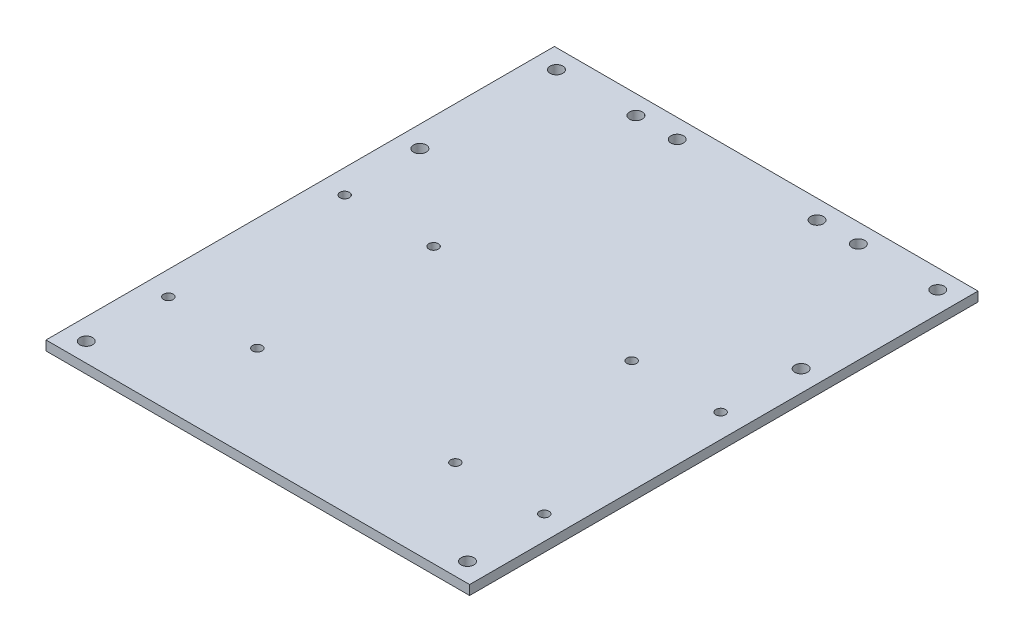
ISO-10303-21;
HEADER;
FILE_DESCRIPTION(('STEP AP214'),'2;1');
FILE_NAME('part.step','',(''),(''),'','','');
FILE_SCHEMA(('AUTOMOTIVE_DESIGN { 1 0 10303 214 1 1 1 1 }'));
ENDSEC;
DATA;
#1=APPLICATION_CONTEXT('core data for automotive mechanical design processes');
#2=APPLICATION_PROTOCOL_DEFINITION('international standard','automotive_design',2000,#1);
#3=PRODUCT_CONTEXT('',#1,'mechanical');
#4=PRODUCT('Part','Part','',(#3));
#5=PRODUCT_RELATED_PRODUCT_CATEGORY('part','',(#4));
#6=PRODUCT_DEFINITION_FORMATION('','',#4);
#7=PRODUCT_DEFINITION_CONTEXT('part definition',#1,'design');
#8=PRODUCT_DEFINITION('design','',#6,#7);
#9=PRODUCT_DEFINITION_SHAPE('','',#8);
#10=(LENGTH_UNIT() NAMED_UNIT(*) SI_UNIT(.MILLI.,.METRE.));
#11=(NAMED_UNIT(*) PLANE_ANGLE_UNIT() SI_UNIT($,.RADIAN.));
#12=(NAMED_UNIT(*) SI_UNIT($,.STERADIAN.) SOLID_ANGLE_UNIT());
#13=UNCERTAINTY_MEASURE_WITH_UNIT(LENGTH_MEASURE(1.E-05),#10,'distance_accuracy_value','');
#14=(GEOMETRIC_REPRESENTATION_CONTEXT(3) GLOBAL_UNCERTAINTY_ASSIGNED_CONTEXT((#13)) GLOBAL_UNIT_ASSIGNED_CONTEXT((#10,
#11,#12)) REPRESENTATION_CONTEXT('',''));
#15=CARTESIAN_POINT('',(0.,0.,0.));
#16=DIRECTION('',(0.,0.,1.));
#17=DIRECTION('',(1.,0.,0.));
#18=AXIS2_PLACEMENT_3D('',#15,#16,#17);
#19=CARTESIAN_POINT('',(66.665,3.,-80.));
#20=DIRECTION('',(-1.,0.,0.));
#21=DIRECTION('',(0.,0.,1.));
#22=AXIS2_PLACEMENT_3D('',#19,#20,#21);
#23=PLANE('',#22);
#24=DIRECTION('',(0.,0.,-1.));
#25=VECTOR('',#24,1.);
#26=CARTESIAN_POINT('',(66.665,0.,-80.));
#27=LINE('',#26,#25);
#28=CARTESIAN_POINT('',(66.665,0.,80.));
#29=VERTEX_POINT('',#28);
#30=CARTESIAN_POINT('',(66.665,0.,-80.));
#31=VERTEX_POINT('',#30);
#32=EDGE_CURVE('E106',#29,#31,#27,.T.);
#33=ORIENTED_EDGE('',*,*,#32,.T.);
#34=DIRECTION('',(0.,-1.,0.));
#35=VECTOR('',#34,1.);
#36=CARTESIAN_POINT('',(66.665,3.,-80.));
#37=LINE('',#36,#35);
#38=CARTESIAN_POINT('',(66.665,3.,-80.));
#39=VERTEX_POINT('',#38);
#40=EDGE_CURVE('E11',#39,#31,#37,.T.);
#41=ORIENTED_EDGE('',*,*,#40,.F.);
#42=DIRECTION('',(0.,0.,-1.));
#43=VECTOR('',#42,1.);
#44=CARTESIAN_POINT('',(66.665,3.,-80.));
#45=LINE('',#44,#43);
#46=CARTESIAN_POINT('',(66.665,3.,80.));
#47=VERTEX_POINT('',#46);
#48=EDGE_CURVE('E93',#47,#39,#45,.T.);
#49=ORIENTED_EDGE('',*,*,#48,.F.);
#50=DIRECTION('',(0.,-1.,0.));
#51=VECTOR('',#50,1.);
#52=CARTESIAN_POINT('',(66.665,3.,80.));
#53=LINE('',#52,#51);
#54=EDGE_CURVE('E102',#47,#29,#53,.T.);
#55=ORIENTED_EDGE('',*,*,#54,.T.);
#56=EDGE_LOOP('',(#33,#41,#49,#55));
#57=FACE_BOUND('',#56,.T.);
#58=ADVANCED_FACE('F40',(#57),#23,.F.);
#59=CARTESIAN_POINT('',(-66.665,3.,-80.));
#60=DIRECTION('',(0.,0.,1.));
#61=DIRECTION('',(1.,0.,0.));
#62=AXIS2_PLACEMENT_3D('',#59,#60,#61);
#63=PLANE('',#62);
#64=DIRECTION('',(-1.,0.,0.));
#65=VECTOR('',#64,1.);
#66=CARTESIAN_POINT('',(-66.665,0.,-80.));
#67=LINE('',#66,#65);
#68=CARTESIAN_POINT('',(-66.665,0.,-80.));
#69=VERTEX_POINT('',#68);
#70=EDGE_CURVE('E97',#31,#69,#67,.T.);
#71=ORIENTED_EDGE('',*,*,#70,.T.);
#72=DIRECTION('',(0.,-1.,0.));
#73=VECTOR('',#72,1.);
#74=CARTESIAN_POINT('',(-66.665,3.,-80.));
#75=LINE('',#74,#73);
#76=CARTESIAN_POINT('',(-66.665,3.,-80.));
#77=VERTEX_POINT('',#76);
#78=EDGE_CURVE('E49',#77,#69,#75,.T.);
#79=ORIENTED_EDGE('',*,*,#78,.F.);
#80=DIRECTION('',(-1.,0.,0.));
#81=VECTOR('',#80,1.);
#82=CARTESIAN_POINT('',(-66.665,3.,-80.));
#83=LINE('',#82,#81);
#84=EDGE_CURVE('E88',#39,#77,#83,.T.);
#85=ORIENTED_EDGE('',*,*,#84,.F.);
#86=ORIENTED_EDGE('',*,*,#40,.T.);
#87=EDGE_LOOP('',(#71,#79,#85,#86));
#88=FACE_BOUND('',#87,.T.);
#89=ADVANCED_FACE('F96',(#88),#63,.F.);
#90=CARTESIAN_POINT('',(-66.665,3.,-80.));
#91=DIRECTION('',(1.,0.,0.));
#92=DIRECTION('',(0.,0.,-1.));
#93=AXIS2_PLACEMENT_3D('',#90,#91,#92);
#94=PLANE('',#93);
#95=DIRECTION('',(0.,0.,1.));
#96=VECTOR('',#95,1.);
#97=CARTESIAN_POINT('',(-66.665,0.,-80.));
#98=LINE('',#97,#96);
#99=CARTESIAN_POINT('',(-66.665,0.,80.));
#100=VERTEX_POINT('',#99);
#101=EDGE_CURVE('E75',#69,#100,#98,.T.);
#102=ORIENTED_EDGE('',*,*,#101,.T.);
#103=DIRECTION('',(0.,-1.,0.));
#104=VECTOR('',#103,1.);
#105=CARTESIAN_POINT('',(-66.665,3.,80.));
#106=LINE('',#105,#104);
#107=CARTESIAN_POINT('',(-66.665,3.,80.));
#108=VERTEX_POINT('',#107);
#109=EDGE_CURVE('E98',#108,#100,#106,.T.);
#110=ORIENTED_EDGE('',*,*,#109,.F.);
#111=DIRECTION('',(0.,0.,1.));
#112=VECTOR('',#111,1.);
#113=CARTESIAN_POINT('',(-66.665,3.,-80.));
#114=LINE('',#113,#112);
#115=EDGE_CURVE('E91',#77,#108,#114,.T.);
#116=ORIENTED_EDGE('',*,*,#115,.F.);
#117=ORIENTED_EDGE('',*,*,#78,.T.);
#118=EDGE_LOOP('',(#102,#110,#116,#117));
#119=FACE_BOUND('',#118,.T.);
#120=ADVANCED_FACE('F100',(#119),#94,.F.);
#121=CARTESIAN_POINT('',(-66.665,3.,80.));
#122=DIRECTION('',(0.,0.,-1.));
#123=DIRECTION('',(-1.,0.,0.));
#124=AXIS2_PLACEMENT_3D('',#121,#122,#123);
#125=PLANE('',#124);
#126=DIRECTION('',(1.,0.,0.));
#127=VECTOR('',#126,1.);
#128=CARTESIAN_POINT('',(-66.665,0.,80.));
#129=LINE('',#128,#127);
#130=EDGE_CURVE('E81',#100,#29,#129,.T.);
#131=ORIENTED_EDGE('',*,*,#130,.T.);
#132=ORIENTED_EDGE('',*,*,#54,.F.);
#133=DIRECTION('',(1.,0.,0.));
#134=VECTOR('',#133,1.);
#135=CARTESIAN_POINT('',(-66.665,3.,80.));
#136=LINE('',#135,#134);
#137=EDGE_CURVE('E58',#108,#47,#136,.T.);
#138=ORIENTED_EDGE('',*,*,#137,.F.);
#139=ORIENTED_EDGE('',*,*,#109,.T.);
#140=EDGE_LOOP('',(#131,#132,#138,#139));
#141=FACE_BOUND('',#140,.T.);
#142=ADVANCED_FACE('F220',(#141),#125,.F.);
#143=CARTESIAN_POINT('',(0.,3.,0.));
#144=DIRECTION('',(0.,1.,0.));
#145=DIRECTION('',(0.,0.,1.));
#146=AXIS2_PLACEMENT_3D('',#143,#144,#145);
#147=PLANE('',#146);
#148=CARTESIAN_POINT('',(-22.,3.,-74.));
#149=DIRECTION('',(0.,1.,0.));
#150=DIRECTION('',(0.,0.,1.));
#151=AXIS2_PLACEMENT_3D('',#148,#149,#150);
#152=CIRCLE('',#151,2.00000000000001);
#153=CARTESIAN_POINT('',(-22.,3.,-72.));
#154=VERTEX_POINT('',#153);
#155=EDGE_CURVE('E503',#154,#154,#152,.T.);
#156=ORIENTED_EDGE('',*,*,#155,.F.);
#157=EDGE_LOOP('',(#156));
#158=FACE_BOUND('',#157,.T.);
#159=CARTESIAN_POINT('',(22.,3.,-74.));
#160=DIRECTION('',(0.,1.,0.));
#161=DIRECTION('',(0.,0.,-1.));
#162=AXIS2_PLACEMENT_3D('',#159,#160,#161);
#163=CIRCLE('',#162,2.00000000000001);
#164=CARTESIAN_POINT('',(22.,3.,-76.));
#165=VERTEX_POINT('',#164);
#166=EDGE_CURVE('E504',#165,#165,#163,.T.);
#167=ORIENTED_EDGE('',*,*,#166,.F.);
#168=EDGE_LOOP('',(#167));
#169=FACE_BOUND('',#168,.T.);
#170=CARTESIAN_POINT('',(-35.,3.,-74.));
#171=DIRECTION('',(0.,1.,0.));
#172=DIRECTION('',(0.,0.,1.));
#173=AXIS2_PLACEMENT_3D('',#170,#171,#172);
#174=CIRCLE('',#173,2.);
#175=CARTESIAN_POINT('',(-35.,3.,-72.));
#176=VERTEX_POINT('',#175);
#177=EDGE_CURVE('E116',#176,#176,#174,.T.);
#178=ORIENTED_EDGE('',*,*,#177,.F.);
#179=EDGE_LOOP('',(#178));
#180=FACE_BOUND('',#179,.T.);
#181=CARTESIAN_POINT('',(35.,3.,-74.));
#182=DIRECTION('',(0.,1.,0.));
#183=DIRECTION('',(0.,0.,1.));
#184=AXIS2_PLACEMENT_3D('',#181,#182,#183);
#185=CIRCLE('',#184,2.);
#186=CARTESIAN_POINT('',(35.,3.,-72.));
#187=VERTEX_POINT('',#186);
#188=EDGE_CURVE('E122',#187,#187,#185,.T.);
#189=ORIENTED_EDGE('',*,*,#188,.F.);
#190=EDGE_LOOP('',(#189));
#191=FACE_BOUND('',#190,.T.);
#192=CARTESIAN_POINT('',(59.165,3.,-6.50000000000002));
#193=DIRECTION('',(0.,1.,0.));
#194=DIRECTION('',(0.,0.,-1.));
#195=AXIS2_PLACEMENT_3D('',#192,#193,#194);
#196=CIRCLE('',#195,1.5);
#197=CARTESIAN_POINT('',(59.165,3.,-8.00000000000002));
#198=VERTEX_POINT('',#197);
#199=EDGE_CURVE('E158',#198,#198,#196,.T.);
#200=ORIENTED_EDGE('',*,*,#199,.F.);
#201=EDGE_LOOP('',(#200));
#202=FACE_BOUND('',#201,.T.);
#203=CARTESIAN_POINT('',(59.165,3.,49.));
#204=DIRECTION('',(0.,1.,0.));
#205=DIRECTION('',(0.,0.,-1.));
#206=AXIS2_PLACEMENT_3D('',#203,#204,#205);
#207=CIRCLE('',#206,1.5);
#208=CARTESIAN_POINT('',(59.165,3.,47.5));
#209=VERTEX_POINT('',#208);
#210=EDGE_CURVE('E152',#209,#209,#207,.T.);
#211=ORIENTED_EDGE('',*,*,#210,.F.);
#212=EDGE_LOOP('',(#211));
#213=FACE_BOUND('',#212,.T.);
#214=CARTESIAN_POINT('',(31.165,3.,49.));
#215=DIRECTION('',(0.,1.,0.));
#216=DIRECTION('',(0.,0.,-1.));
#217=AXIS2_PLACEMENT_3D('',#214,#215,#216);
#218=CIRCLE('',#217,1.5);
#219=CARTESIAN_POINT('',(31.165,3.,47.5));
#220=VERTEX_POINT('',#219);
#221=EDGE_CURVE('E146',#220,#220,#218,.T.);
#222=ORIENTED_EDGE('',*,*,#221,.F.);
#223=EDGE_LOOP('',(#222));
#224=FACE_BOUND('',#223,.T.);
#225=CARTESIAN_POINT('',(-31.165,3.,49.));
#226=DIRECTION('',(0.,1.,0.));
#227=DIRECTION('',(0.,0.,1.));
#228=AXIS2_PLACEMENT_3D('',#225,#226,#227);
#229=CIRCLE('',#228,1.5);
#230=CARTESIAN_POINT('',(-31.165,3.,50.5));
#231=VERTEX_POINT('',#230);
#232=EDGE_CURVE('E139',#231,#231,#229,.T.);
#233=ORIENTED_EDGE('',*,*,#232,.F.);
#234=EDGE_LOOP('',(#233));
#235=FACE_BOUND('',#234,.T.);
#236=CARTESIAN_POINT('',(60.,3.,-31.));
#237=DIRECTION('',(0.,1.,0.));
#238=DIRECTION('',(0.,0.,-1.));
#239=AXIS2_PLACEMENT_3D('',#236,#237,#238);
#240=CIRCLE('',#239,2.);
#241=CARTESIAN_POINT('',(60.,3.,-33.));
#242=VERTEX_POINT('',#241);
#243=EDGE_CURVE('E175',#242,#242,#240,.T.);
#244=ORIENTED_EDGE('',*,*,#243,.F.);
#245=EDGE_LOOP('',(#244));
#246=FACE_BOUND('',#245,.T.);
#247=CARTESIAN_POINT('',(-59.165,3.,-6.50000000000002));
#248=DIRECTION('',(0.,1.,0.));
#249=DIRECTION('',(0.,0.,1.));
#250=AXIS2_PLACEMENT_3D('',#247,#248,#249);
#251=CIRCLE('',#250,1.5);
#252=CARTESIAN_POINT('',(-59.165,3.,-5.00000000000002));
#253=VERTEX_POINT('',#252);
#254=EDGE_CURVE('E182',#253,#253,#251,.T.);
#255=ORIENTED_EDGE('',*,*,#254,.F.);
#256=EDGE_LOOP('',(#255));
#257=FACE_BOUND('',#256,.T.);
#258=CARTESIAN_POINT('',(-31.165,3.,-6.50000000000002));
#259=DIRECTION('',(0.,1.,0.));
#260=DIRECTION('',(0.,0.,1.));
#261=AXIS2_PLACEMENT_3D('',#258,#259,#260);
#262=CIRCLE('',#261,1.5);
#263=CARTESIAN_POINT('',(-31.165,3.,-5.00000000000002));
#264=VERTEX_POINT('',#263);
#265=EDGE_CURVE('E163',#264,#264,#262,.T.);
#266=ORIENTED_EDGE('',*,*,#265,.F.);
#267=EDGE_LOOP('',(#266));
#268=FACE_BOUND('',#267,.T.);
#269=CARTESIAN_POINT('',(-59.165,3.,49.));
#270=DIRECTION('',(0.,1.,0.));
#271=DIRECTION('',(0.,0.,1.));
#272=AXIS2_PLACEMENT_3D('',#269,#270,#271);
#273=CIRCLE('',#272,1.5);
#274=CARTESIAN_POINT('',(-59.165,3.,50.5));
#275=VERTEX_POINT('',#274);
#276=EDGE_CURVE('E170',#275,#275,#273,.T.);
#277=ORIENTED_EDGE('',*,*,#276,.F.);
#278=EDGE_LOOP('',(#277));
#279=FACE_BOUND('',#278,.T.);
#280=CARTESIAN_POINT('',(31.165,3.,-6.50000000000002));
#281=DIRECTION('',(0.,1.,0.));
#282=DIRECTION('',(0.,0.,-1.));
#283=AXIS2_PLACEMENT_3D('',#280,#281,#282);
#284=CIRCLE('',#283,1.5);
#285=CARTESIAN_POINT('',(31.165,3.,-8.00000000000002));
#286=VERTEX_POINT('',#285);
#287=EDGE_CURVE('E133',#286,#286,#284,.T.);
#288=ORIENTED_EDGE('',*,*,#287,.F.);
#289=EDGE_LOOP('',(#288));
#290=FACE_BOUND('',#289,.T.);
#291=CARTESIAN_POINT('',(-60.,3.,-31.));
#292=DIRECTION('',(0.,1.,0.));
#293=DIRECTION('',(0.,0.,1.));
#294=AXIS2_PLACEMENT_3D('',#291,#292,#293);
#295=CIRCLE('',#294,2.);
#296=CARTESIAN_POINT('',(-60.,3.,-29.));
#297=VERTEX_POINT('',#296);
#298=EDGE_CURVE('E178',#297,#297,#295,.T.);
#299=ORIENTED_EDGE('',*,*,#298,.F.);
#300=EDGE_LOOP('',(#299));
#301=FACE_BOUND('',#300,.T.);
#302=CARTESIAN_POINT('',(-60.,3.,74.));
#303=DIRECTION('',(0.,1.,0.));
#304=DIRECTION('',(0.,0.,-1.));
#305=AXIS2_PLACEMENT_3D('',#302,#303,#304);
#306=CIRCLE('',#305,2.);
#307=CARTESIAN_POINT('',(-60.,3.,72.));
#308=VERTEX_POINT('',#307);
#309=EDGE_CURVE('E206',#308,#308,#306,.T.);
#310=ORIENTED_EDGE('',*,*,#309,.F.);
#311=EDGE_LOOP('',(#310));
#312=FACE_BOUND('',#311,.T.);
#313=CARTESIAN_POINT('',(60.,3.,74.));
#314=DIRECTION('',(0.,1.,0.));
#315=DIRECTION('',(0.,0.,1.));
#316=AXIS2_PLACEMENT_3D('',#313,#314,#315);
#317=CIRCLE('',#316,2.);
#318=CARTESIAN_POINT('',(60.,3.,76.));
#319=VERTEX_POINT('',#318);
#320=EDGE_CURVE('E200',#319,#319,#317,.T.);
#321=ORIENTED_EDGE('',*,*,#320,.F.);
#322=EDGE_LOOP('',(#321));
#323=FACE_BOUND('',#322,.T.);
#324=CARTESIAN_POINT('',(60.,3.,-74.));
#325=DIRECTION('',(0.,1.,0.));
#326=DIRECTION('',(0.,0.,-1.));
#327=AXIS2_PLACEMENT_3D('',#324,#325,#326);
#328=CIRCLE('',#327,2.);
#329=CARTESIAN_POINT('',(60.,3.,-76.));
#330=VERTEX_POINT('',#329);
#331=EDGE_CURVE('E193',#330,#330,#328,.T.);
#332=ORIENTED_EDGE('',*,*,#331,.F.);
#333=EDGE_LOOP('',(#332));
#334=FACE_BOUND('',#333,.T.);
#335=CARTESIAN_POINT('',(-60.,3.,-74.));
#336=DIRECTION('',(0.,1.,0.));
#337=DIRECTION('',(0.,0.,1.));
#338=AXIS2_PLACEMENT_3D('',#335,#336,#337);
#339=CIRCLE('',#338,2.);
#340=CARTESIAN_POINT('',(-60.,3.,-72.));
#341=VERTEX_POINT('',#340);
#342=EDGE_CURVE('E196',#341,#341,#339,.T.);
#343=ORIENTED_EDGE('',*,*,#342,.F.);
#344=EDGE_LOOP('',(#343));
#345=FACE_BOUND('',#344,.T.);
#346=ORIENTED_EDGE('',*,*,#48,.T.);
#347=ORIENTED_EDGE('',*,*,#84,.T.);
#348=ORIENTED_EDGE('',*,*,#115,.T.);
#349=ORIENTED_EDGE('',*,*,#137,.T.);
#350=EDGE_LOOP('',(#346,#347,#348,#349));
#351=FACE_BOUND('',#350,.T.);
#352=ADVANCED_FACE('F89',(#158,#169,#180,#191,#202,#213,#224,#235,#246,#257,#268,#279,#290,#301,
#312,#323,#334,#345,#351),#147,.T.);
#353=CARTESIAN_POINT('',(0.,0.,0.));
#354=DIRECTION('',(0.,1.,0.));
#355=DIRECTION('',(0.,0.,1.));
#356=AXIS2_PLACEMENT_3D('',#353,#354,#355);
#357=PLANE('',#356);
#358=CARTESIAN_POINT('',(-22.,0.,-74.));
#359=DIRECTION('',(0.,1.,0.));
#360=DIRECTION('',(0.,0.,1.));
#361=AXIS2_PLACEMENT_3D('',#358,#359,#360);
#362=CIRCLE('',#361,2.00000000000001);
#363=CARTESIAN_POINT('',(-22.,0.,-72.));
#364=VERTEX_POINT('',#363);
#365=EDGE_CURVE('E127',#364,#364,#362,.T.);
#366=ORIENTED_EDGE('',*,*,#365,.T.);
#367=EDGE_LOOP('',(#366));
#368=FACE_BOUND('',#367,.T.);
#369=CARTESIAN_POINT('',(22.,0.,-74.));
#370=DIRECTION('',(0.,1.,0.));
#371=DIRECTION('',(0.,0.,-1.));
#372=AXIS2_PLACEMENT_3D('',#369,#370,#371);
#373=CIRCLE('',#372,2.00000000000001);
#374=CARTESIAN_POINT('',(22.,0.,-76.));
#375=VERTEX_POINT('',#374);
#376=EDGE_CURVE('E130',#375,#375,#373,.T.);
#377=ORIENTED_EDGE('',*,*,#376,.T.);
#378=EDGE_LOOP('',(#377));
#379=FACE_BOUND('',#378,.T.);
#380=CARTESIAN_POINT('',(-35.,0.,-74.));
#381=DIRECTION('',(0.,1.,0.));
#382=DIRECTION('',(0.,0.,1.));
#383=AXIS2_PLACEMENT_3D('',#380,#381,#382);
#384=CIRCLE('',#383,2.);
#385=CARTESIAN_POINT('',(-35.,0.,-72.));
#386=VERTEX_POINT('',#385);
#387=EDGE_CURVE('E43',#386,#386,#384,.T.);
#388=ORIENTED_EDGE('',*,*,#387,.T.);
#389=EDGE_LOOP('',(#388));
#390=FACE_BOUND('',#389,.T.);
#391=CARTESIAN_POINT('',(35.,0.,-74.));
#392=DIRECTION('',(0.,1.,0.));
#393=DIRECTION('',(0.,0.,1.));
#394=AXIS2_PLACEMENT_3D('',#391,#392,#393);
#395=CIRCLE('',#394,2.);
#396=CARTESIAN_POINT('',(35.,0.,-72.));
#397=VERTEX_POINT('',#396);
#398=EDGE_CURVE('E114',#397,#397,#395,.T.);
#399=ORIENTED_EDGE('',*,*,#398,.T.);
#400=EDGE_LOOP('',(#399));
#401=FACE_BOUND('',#400,.T.);
#402=CARTESIAN_POINT('',(59.165,0.,-6.50000000000002));
#403=DIRECTION('',(0.,1.,0.));
#404=DIRECTION('',(0.,0.,-1.));
#405=AXIS2_PLACEMENT_3D('',#402,#403,#404);
#406=CIRCLE('',#405,1.5);
#407=CARTESIAN_POINT('',(59.165,0.,-8.00000000000002));
#408=VERTEX_POINT('',#407);
#409=EDGE_CURVE('E136',#408,#408,#406,.T.);
#410=ORIENTED_EDGE('',*,*,#409,.T.);
#411=EDGE_LOOP('',(#410));
#412=FACE_BOUND('',#411,.T.);
#413=CARTESIAN_POINT('',(59.165,0.,49.));
#414=DIRECTION('',(0.,1.,0.));
#415=DIRECTION('',(0.,0.,-1.));
#416=AXIS2_PLACEMENT_3D('',#413,#414,#415);
#417=CIRCLE('',#416,1.5);
#418=CARTESIAN_POINT('',(59.165,0.,47.5));
#419=VERTEX_POINT('',#418);
#420=EDGE_CURVE('E155',#419,#419,#417,.T.);
#421=ORIENTED_EDGE('',*,*,#420,.T.);
#422=EDGE_LOOP('',(#421));
#423=FACE_BOUND('',#422,.T.);
#424=CARTESIAN_POINT('',(31.165,0.,49.));
#425=DIRECTION('',(0.,1.,0.));
#426=DIRECTION('',(0.,0.,-1.));
#427=AXIS2_PLACEMENT_3D('',#424,#425,#426);
#428=CIRCLE('',#427,1.5);
#429=CARTESIAN_POINT('',(31.165,0.,47.5));
#430=VERTEX_POINT('',#429);
#431=EDGE_CURVE('E149',#430,#430,#428,.T.);
#432=ORIENTED_EDGE('',*,*,#431,.T.);
#433=EDGE_LOOP('',(#432));
#434=FACE_BOUND('',#433,.T.);
#435=CARTESIAN_POINT('',(-31.165,0.,49.));
#436=DIRECTION('',(0.,1.,0.));
#437=DIRECTION('',(0.,0.,1.));
#438=AXIS2_PLACEMENT_3D('',#435,#436,#437);
#439=CIRCLE('',#438,1.5);
#440=CARTESIAN_POINT('',(-31.165,0.,50.5));
#441=VERTEX_POINT('',#440);
#442=EDGE_CURVE('E143',#441,#441,#439,.T.);
#443=ORIENTED_EDGE('',*,*,#442,.T.);
#444=EDGE_LOOP('',(#443));
#445=FACE_BOUND('',#444,.T.);
#446=CARTESIAN_POINT('',(60.,0.,-31.));
#447=DIRECTION('',(0.,1.,0.));
#448=DIRECTION('',(0.,0.,-1.));
#449=AXIS2_PLACEMENT_3D('',#446,#447,#448);
#450=CIRCLE('',#449,2.);
#451=CARTESIAN_POINT('',(60.,0.,-33.));
#452=VERTEX_POINT('',#451);
#453=EDGE_CURVE('E179',#452,#452,#450,.T.);
#454=ORIENTED_EDGE('',*,*,#453,.T.);
#455=EDGE_LOOP('',(#454));
#456=FACE_BOUND('',#455,.T.);
#457=CARTESIAN_POINT('',(-59.165,0.,-6.50000000000002));
#458=DIRECTION('',(0.,1.,0.));
#459=DIRECTION('',(0.,0.,1.));
#460=AXIS2_PLACEMENT_3D('',#457,#458,#459);
#461=CIRCLE('',#460,1.5);
#462=CARTESIAN_POINT('',(-59.165,0.,-5.00000000000002));
#463=VERTEX_POINT('',#462);
#464=EDGE_CURVE('E166',#463,#463,#461,.T.);
#465=ORIENTED_EDGE('',*,*,#464,.T.);
#466=EDGE_LOOP('',(#465));
#467=FACE_BOUND('',#466,.T.);
#468=CARTESIAN_POINT('',(-31.165,0.,-6.50000000000002));
#469=DIRECTION('',(0.,1.,0.));
#470=DIRECTION('',(0.,0.,1.));
#471=AXIS2_PLACEMENT_3D('',#468,#469,#470);
#472=CIRCLE('',#471,1.5);
#473=CARTESIAN_POINT('',(-31.165,0.,-5.00000000000002));
#474=VERTEX_POINT('',#473);
#475=EDGE_CURVE('E167',#474,#474,#472,.T.);
#476=ORIENTED_EDGE('',*,*,#475,.T.);
#477=EDGE_LOOP('',(#476));
#478=FACE_BOUND('',#477,.T.);
#479=CARTESIAN_POINT('',(-59.165,0.,49.));
#480=DIRECTION('',(0.,1.,0.));
#481=DIRECTION('',(0.,0.,1.));
#482=AXIS2_PLACEMENT_3D('',#479,#480,#481);
#483=CIRCLE('',#482,1.5);
#484=CARTESIAN_POINT('',(-59.165,0.,50.5));
#485=VERTEX_POINT('',#484);
#486=EDGE_CURVE('E142',#485,#485,#483,.T.);
#487=ORIENTED_EDGE('',*,*,#486,.T.);
#488=EDGE_LOOP('',(#487));
#489=FACE_BOUND('',#488,.T.);
#490=CARTESIAN_POINT('',(31.165,0.,-6.50000000000002));
#491=DIRECTION('',(0.,1.,0.));
#492=DIRECTION('',(0.,0.,-1.));
#493=AXIS2_PLACEMENT_3D('',#490,#491,#492);
#494=CIRCLE('',#493,1.5);
#495=CARTESIAN_POINT('',(31.165,0.,-8.00000000000002));
#496=VERTEX_POINT('',#495);
#497=EDGE_CURVE('E120',#496,#496,#494,.T.);
#498=ORIENTED_EDGE('',*,*,#497,.T.);
#499=EDGE_LOOP('',(#498));
#500=FACE_BOUND('',#499,.T.);
#501=CARTESIAN_POINT('',(-60.,0.,-31.));
#502=DIRECTION('',(0.,1.,0.));
#503=DIRECTION('',(0.,0.,1.));
#504=AXIS2_PLACEMENT_3D('',#501,#502,#503);
#505=CIRCLE('',#504,2.);
#506=CARTESIAN_POINT('',(-60.,0.,-29.));
#507=VERTEX_POINT('',#506);
#508=EDGE_CURVE('E187',#507,#507,#505,.T.);
#509=ORIENTED_EDGE('',*,*,#508,.T.);
#510=EDGE_LOOP('',(#509));
#511=FACE_BOUND('',#510,.T.);
#512=CARTESIAN_POINT('',(-60.,0.,74.));
#513=DIRECTION('',(0.,1.,0.));
#514=DIRECTION('',(0.,0.,-1.));
#515=AXIS2_PLACEMENT_3D('',#512,#513,#514);
#516=CIRCLE('',#515,2.);
#517=CARTESIAN_POINT('',(-60.,0.,72.));
#518=VERTEX_POINT('',#517);
#519=EDGE_CURVE('E190',#518,#518,#516,.T.);
#520=ORIENTED_EDGE('',*,*,#519,.T.);
#521=EDGE_LOOP('',(#520));
#522=FACE_BOUND('',#521,.T.);
#523=CARTESIAN_POINT('',(60.,0.,74.));
#524=DIRECTION('',(0.,1.,0.));
#525=DIRECTION('',(0.,0.,1.));
#526=AXIS2_PLACEMENT_3D('',#523,#524,#525);
#527=CIRCLE('',#526,2.);
#528=CARTESIAN_POINT('',(60.,0.,76.));
#529=VERTEX_POINT('',#528);
#530=EDGE_CURVE('E203',#529,#529,#527,.T.);
#531=ORIENTED_EDGE('',*,*,#530,.T.);
#532=EDGE_LOOP('',(#531));
#533=FACE_BOUND('',#532,.T.);
#534=CARTESIAN_POINT('',(60.,0.,-74.));
#535=DIRECTION('',(0.,1.,0.));
#536=DIRECTION('',(0.,0.,-1.));
#537=AXIS2_PLACEMENT_3D('',#534,#535,#536);
#538=CIRCLE('',#537,2.);
#539=CARTESIAN_POINT('',(60.,0.,-76.));
#540=VERTEX_POINT('',#539);
#541=EDGE_CURVE('E197',#540,#540,#538,.T.);
#542=ORIENTED_EDGE('',*,*,#541,.T.);
#543=EDGE_LOOP('',(#542));
#544=FACE_BOUND('',#543,.T.);
#545=CARTESIAN_POINT('',(-60.,0.,-74.));
#546=DIRECTION('',(0.,1.,0.));
#547=DIRECTION('',(0.,0.,1.));
#548=AXIS2_PLACEMENT_3D('',#545,#546,#547);
#549=CIRCLE('',#548,2.);
#550=CARTESIAN_POINT('',(-60.,0.,-72.));
#551=VERTEX_POINT('',#550);
#552=EDGE_CURVE('E109',#551,#551,#549,.T.);
#553=ORIENTED_EDGE('',*,*,#552,.T.);
#554=EDGE_LOOP('',(#553));
#555=FACE_BOUND('',#554,.T.);
#556=ORIENTED_EDGE('',*,*,#32,.F.);
#557=ORIENTED_EDGE('',*,*,#130,.F.);
#558=ORIENTED_EDGE('',*,*,#101,.F.);
#559=ORIENTED_EDGE('',*,*,#70,.F.);
#560=EDGE_LOOP('',(#556,#557,#558,#559));
#561=FACE_BOUND('',#560,.T.);
#562=ADVANCED_FACE('F219',(#368,#379,#390,#401,#412,#423,#434,#445,#456,#467,#478,#489,#500,
#511,#522,#533,#544,#555,#561),#357,.F.);
#563=CARTESIAN_POINT('',(-60.,0.,-74.));
#564=DIRECTION('',(0.,1.,0.));
#565=DIRECTION('',(0.,0.,1.));
#566=AXIS2_PLACEMENT_3D('',#563,#564,#565);
#567=CYLINDRICAL_SURFACE('',#566,2.);
#568=ORIENTED_EDGE('',*,*,#552,.F.);
#569=EDGE_LOOP('',(#568));
#570=FACE_BOUND('',#569,.T.);
#571=ORIENTED_EDGE('',*,*,#342,.T.);
#572=EDGE_LOOP('',(#571));
#573=FACE_BOUND('',#572,.T.);
#574=ADVANCED_FACE('F216',(#570,#573),#567,.F.);
#575=CARTESIAN_POINT('',(60.,0.,-74.));
#576=DIRECTION('',(0.,1.,0.));
#577=DIRECTION('',(0.,0.,1.));
#578=AXIS2_PLACEMENT_3D('',#575,#576,#577);
#579=CYLINDRICAL_SURFACE('',#578,2.);
#580=ORIENTED_EDGE('',*,*,#541,.F.);
#581=EDGE_LOOP('',(#580));
#582=FACE_BOUND('',#581,.T.);
#583=ORIENTED_EDGE('',*,*,#331,.T.);
#584=EDGE_LOOP('',(#583));
#585=FACE_BOUND('',#584,.T.);
#586=ADVANCED_FACE('F261',(#582,#585),#579,.F.);
#587=CARTESIAN_POINT('',(60.,0.,74.));
#588=DIRECTION('',(0.,1.,0.));
#589=DIRECTION('',(0.,0.,1.));
#590=AXIS2_PLACEMENT_3D('',#587,#588,#589);
#591=CYLINDRICAL_SURFACE('',#590,2.);
#592=ORIENTED_EDGE('',*,*,#530,.F.);
#593=EDGE_LOOP('',(#592));
#594=FACE_BOUND('',#593,.T.);
#595=ORIENTED_EDGE('',*,*,#320,.T.);
#596=EDGE_LOOP('',(#595));
#597=FACE_BOUND('',#596,.T.);
#598=ADVANCED_FACE('F272',(#594,#597),#591,.F.);
#599=CARTESIAN_POINT('',(-60.,0.,74.));
#600=DIRECTION('',(0.,1.,0.));
#601=DIRECTION('',(0.,0.,1.));
#602=AXIS2_PLACEMENT_3D('',#599,#600,#601);
#603=CYLINDRICAL_SURFACE('',#602,2.);
#604=ORIENTED_EDGE('',*,*,#519,.F.);
#605=EDGE_LOOP('',(#604));
#606=FACE_BOUND('',#605,.T.);
#607=ORIENTED_EDGE('',*,*,#309,.T.);
#608=EDGE_LOOP('',(#607));
#609=FACE_BOUND('',#608,.T.);
#610=ADVANCED_FACE('F283',(#606,#609),#603,.F.);
#611=CARTESIAN_POINT('',(-60.,0.,-31.));
#612=DIRECTION('',(0.,1.,0.));
#613=DIRECTION('',(0.,0.,1.));
#614=AXIS2_PLACEMENT_3D('',#611,#612,#613);
#615=CYLINDRICAL_SURFACE('',#614,2.);
#616=ORIENTED_EDGE('',*,*,#508,.F.);
#617=EDGE_LOOP('',(#616));
#618=FACE_BOUND('',#617,.T.);
#619=ORIENTED_EDGE('',*,*,#298,.T.);
#620=EDGE_LOOP('',(#619));
#621=FACE_BOUND('',#620,.T.);
#622=ADVANCED_FACE('F294',(#618,#621),#615,.F.);
#623=CARTESIAN_POINT('',(31.165,0.,-6.50000000000002));
#624=DIRECTION('',(0.,1.,0.));
#625=DIRECTION('',(0.,0.,1.));
#626=AXIS2_PLACEMENT_3D('',#623,#624,#625);
#627=CYLINDRICAL_SURFACE('',#626,1.5);
#628=ORIENTED_EDGE('',*,*,#497,.F.);
#629=EDGE_LOOP('',(#628));
#630=FACE_BOUND('',#629,.T.);
#631=ORIENTED_EDGE('',*,*,#287,.T.);
#632=EDGE_LOOP('',(#631));
#633=FACE_BOUND('',#632,.T.);
#634=ADVANCED_FACE('F305',(#630,#633),#627,.F.);
#635=CARTESIAN_POINT('',(-59.165,0.,49.));
#636=DIRECTION('',(0.,1.,0.));
#637=DIRECTION('',(0.,0.,1.));
#638=AXIS2_PLACEMENT_3D('',#635,#636,#637);
#639=CYLINDRICAL_SURFACE('',#638,1.5);
#640=ORIENTED_EDGE('',*,*,#486,.F.);
#641=EDGE_LOOP('',(#640));
#642=FACE_BOUND('',#641,.T.);
#643=ORIENTED_EDGE('',*,*,#276,.T.);
#644=EDGE_LOOP('',(#643));
#645=FACE_BOUND('',#644,.T.);
#646=ADVANCED_FACE('F316',(#642,#645),#639,.F.);
#647=CARTESIAN_POINT('',(-31.165,0.,-6.50000000000002));
#648=DIRECTION('',(0.,1.,0.));
#649=DIRECTION('',(0.,0.,1.));
#650=AXIS2_PLACEMENT_3D('',#647,#648,#649);
#651=CYLINDRICAL_SURFACE('',#650,1.5);
#652=ORIENTED_EDGE('',*,*,#475,.F.);
#653=EDGE_LOOP('',(#652));
#654=FACE_BOUND('',#653,.T.);
#655=ORIENTED_EDGE('',*,*,#265,.T.);
#656=EDGE_LOOP('',(#655));
#657=FACE_BOUND('',#656,.T.);
#658=ADVANCED_FACE('F327',(#654,#657),#651,.F.);
#659=CARTESIAN_POINT('',(-59.165,0.,-6.50000000000002));
#660=DIRECTION('',(0.,1.,0.));
#661=DIRECTION('',(0.,0.,1.));
#662=AXIS2_PLACEMENT_3D('',#659,#660,#661);
#663=CYLINDRICAL_SURFACE('',#662,1.5);
#664=ORIENTED_EDGE('',*,*,#464,.F.);
#665=EDGE_LOOP('',(#664));
#666=FACE_BOUND('',#665,.T.);
#667=ORIENTED_EDGE('',*,*,#254,.T.);
#668=EDGE_LOOP('',(#667));
#669=FACE_BOUND('',#668,.T.);
#670=ADVANCED_FACE('F338',(#666,#669),#663,.F.);
#671=CARTESIAN_POINT('',(60.,0.,-31.));
#672=DIRECTION('',(0.,1.,0.));
#673=DIRECTION('',(0.,0.,1.));
#674=AXIS2_PLACEMENT_3D('',#671,#672,#673);
#675=CYLINDRICAL_SURFACE('',#674,2.);
#676=ORIENTED_EDGE('',*,*,#453,.F.);
#677=EDGE_LOOP('',(#676));
#678=FACE_BOUND('',#677,.T.);
#679=ORIENTED_EDGE('',*,*,#243,.T.);
#680=EDGE_LOOP('',(#679));
#681=FACE_BOUND('',#680,.T.);
#682=ADVANCED_FACE('F349',(#678,#681),#675,.F.);
#683=CARTESIAN_POINT('',(-31.165,0.,49.));
#684=DIRECTION('',(0.,1.,0.));
#685=DIRECTION('',(0.,0.,1.));
#686=AXIS2_PLACEMENT_3D('',#683,#684,#685);
#687=CYLINDRICAL_SURFACE('',#686,1.5);
#688=ORIENTED_EDGE('',*,*,#442,.F.);
#689=EDGE_LOOP('',(#688));
#690=FACE_BOUND('',#689,.T.);
#691=ORIENTED_EDGE('',*,*,#232,.T.);
#692=EDGE_LOOP('',(#691));
#693=FACE_BOUND('',#692,.T.);
#694=ADVANCED_FACE('F360',(#690,#693),#687,.F.);
#695=CARTESIAN_POINT('',(31.165,0.,49.));
#696=DIRECTION('',(0.,1.,0.));
#697=DIRECTION('',(0.,0.,1.));
#698=AXIS2_PLACEMENT_3D('',#695,#696,#697);
#699=CYLINDRICAL_SURFACE('',#698,1.5);
#700=ORIENTED_EDGE('',*,*,#431,.F.);
#701=EDGE_LOOP('',(#700));
#702=FACE_BOUND('',#701,.T.);
#703=ORIENTED_EDGE('',*,*,#221,.T.);
#704=EDGE_LOOP('',(#703));
#705=FACE_BOUND('',#704,.T.);
#706=ADVANCED_FACE('F371',(#702,#705),#699,.F.);
#707=CARTESIAN_POINT('',(59.165,0.,49.));
#708=DIRECTION('',(0.,1.,0.));
#709=DIRECTION('',(0.,0.,1.));
#710=AXIS2_PLACEMENT_3D('',#707,#708,#709);
#711=CYLINDRICAL_SURFACE('',#710,1.5);
#712=ORIENTED_EDGE('',*,*,#420,.F.);
#713=EDGE_LOOP('',(#712));
#714=FACE_BOUND('',#713,.T.);
#715=ORIENTED_EDGE('',*,*,#210,.T.);
#716=EDGE_LOOP('',(#715));
#717=FACE_BOUND('',#716,.T.);
#718=ADVANCED_FACE('F382',(#714,#717),#711,.F.);
#719=CARTESIAN_POINT('',(59.165,0.,-6.50000000000002));
#720=DIRECTION('',(0.,1.,0.));
#721=DIRECTION('',(0.,0.,1.));
#722=AXIS2_PLACEMENT_3D('',#719,#720,#721);
#723=CYLINDRICAL_SURFACE('',#722,1.5);
#724=ORIENTED_EDGE('',*,*,#409,.F.);
#725=EDGE_LOOP('',(#724));
#726=FACE_BOUND('',#725,.T.);
#727=ORIENTED_EDGE('',*,*,#199,.T.);
#728=EDGE_LOOP('',(#727));
#729=FACE_BOUND('',#728,.T.);
#730=ADVANCED_FACE('F393',(#726,#729),#723,.F.);
#731=CARTESIAN_POINT('',(35.,-0.175,-74.));
#732=DIRECTION('',(0.,1.,0.));
#733=DIRECTION('',(0.,0.,1.));
#734=AXIS2_PLACEMENT_3D('',#731,#732,#733);
#735=CYLINDRICAL_SURFACE('',#734,2.);
#736=ORIENTED_EDGE('',*,*,#188,.T.);
#737=EDGE_LOOP('',(#736));
#738=FACE_BOUND('',#737,.T.);
#739=ORIENTED_EDGE('',*,*,#398,.F.);
#740=EDGE_LOOP('',(#739));
#741=FACE_BOUND('',#740,.T.);
#742=ADVANCED_FACE('F404',(#738,#741),#735,.F.);
#743=CARTESIAN_POINT('',(-35.,-0.175,-74.));
#744=DIRECTION('',(0.,1.,0.));
#745=DIRECTION('',(0.,0.,1.));
#746=AXIS2_PLACEMENT_3D('',#743,#744,#745);
#747=CYLINDRICAL_SURFACE('',#746,2.);
#748=ORIENTED_EDGE('',*,*,#177,.T.);
#749=EDGE_LOOP('',(#748));
#750=FACE_BOUND('',#749,.T.);
#751=ORIENTED_EDGE('',*,*,#387,.F.);
#752=EDGE_LOOP('',(#751));
#753=FACE_BOUND('',#752,.T.);
#754=ADVANCED_FACE('F415',(#750,#753),#747,.F.);
#755=CARTESIAN_POINT('',(22.,0.,-74.));
#756=DIRECTION('',(0.,1.,0.));
#757=DIRECTION('',(0.,0.,1.));
#758=AXIS2_PLACEMENT_3D('',#755,#756,#757);
#759=CYLINDRICAL_SURFACE('',#758,2.00000000000001);
#760=ORIENTED_EDGE('',*,*,#376,.F.);
#761=EDGE_LOOP('',(#760));
#762=FACE_BOUND('',#761,.T.);
#763=ORIENTED_EDGE('',*,*,#166,.T.);
#764=EDGE_LOOP('',(#763));
#765=FACE_BOUND('',#764,.T.);
#766=ADVANCED_FACE('F425',(#762,#765),#759,.F.);
#767=CARTESIAN_POINT('',(-22.,0.,-74.));
#768=DIRECTION('',(0.,1.,0.));
#769=DIRECTION('',(0.,0.,1.));
#770=AXIS2_PLACEMENT_3D('',#767,#768,#769);
#771=CYLINDRICAL_SURFACE('',#770,2.00000000000001);
#772=ORIENTED_EDGE('',*,*,#365,.F.);
#773=EDGE_LOOP('',(#772));
#774=FACE_BOUND('',#773,.T.);
#775=ORIENTED_EDGE('',*,*,#155,.T.);
#776=EDGE_LOOP('',(#775));
#777=FACE_BOUND('',#776,.T.);
#778=ADVANCED_FACE('F446',(#774,#777),#771,.F.);
#779=CLOSED_SHELL('',(#58,#89,#120,#142,#352,#562,#574,#586,#598,#610,#622,#634,#646,#658,#670,
#682,#694,#706,#718,#730,#742,#754,#766,#778));
#780=MANIFOLD_SOLID_BREP('B2',#779);
#781=ADVANCED_BREP_SHAPE_REPRESENTATION('',(#18,#780),#14);
#782=SHAPE_DEFINITION_REPRESENTATION(#9,#781);
ENDSEC;
END-ISO-10303-21;
